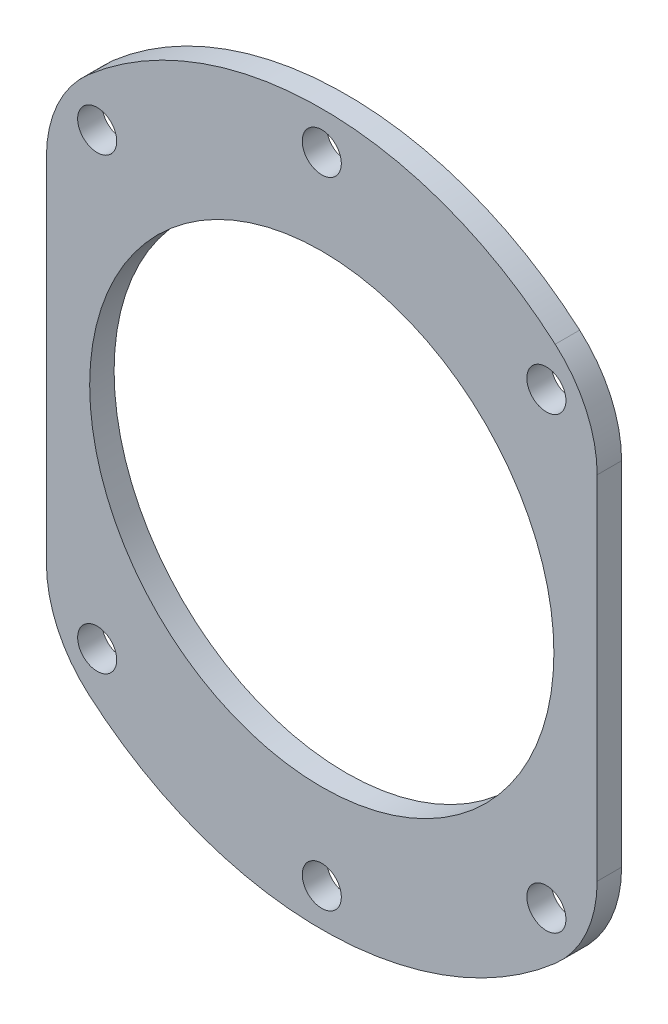
ISO-10303-21;
HEADER;
FILE_DESCRIPTION(('STEP AP214'),'2;1');
FILE_NAME('part.step','',(''),(''),'','','');
FILE_SCHEMA(('AUTOMOTIVE_DESIGN { 1 0 10303 214 1 1 1 1 }'));
ENDSEC;
DATA;
#1=APPLICATION_CONTEXT('core data for automotive mechanical design processes');
#2=APPLICATION_PROTOCOL_DEFINITION('international standard','automotive_design',2000,#1);
#3=PRODUCT_CONTEXT('',#1,'mechanical');
#4=PRODUCT('Part','Part','',(#3));
#5=PRODUCT_RELATED_PRODUCT_CATEGORY('part','',(#4));
#6=PRODUCT_DEFINITION_FORMATION('','',#4);
#7=PRODUCT_DEFINITION_CONTEXT('part definition',#1,'design');
#8=PRODUCT_DEFINITION('design','',#6,#7);
#9=PRODUCT_DEFINITION_SHAPE('','',#8);
#10=(LENGTH_UNIT() NAMED_UNIT(*) SI_UNIT(.MILLI.,.METRE.));
#11=(NAMED_UNIT(*) PLANE_ANGLE_UNIT() SI_UNIT($,.RADIAN.));
#12=(NAMED_UNIT(*) SI_UNIT($,.STERADIAN.) SOLID_ANGLE_UNIT());
#13=UNCERTAINTY_MEASURE_WITH_UNIT(LENGTH_MEASURE(1.E-05),#10,'distance_accuracy_value','');
#14=(GEOMETRIC_REPRESENTATION_CONTEXT(3) GLOBAL_UNCERTAINTY_ASSIGNED_CONTEXT((#13)) GLOBAL_UNIT_ASSIGNED_CONTEXT((#10,
#11,#12)) REPRESENTATION_CONTEXT('',''));
#15=CARTESIAN_POINT('',(0.,0.,0.));
#16=DIRECTION('',(0.,0.,1.));
#17=DIRECTION('',(1.,0.,0.));
#18=AXIS2_PLACEMENT_3D('',#15,#16,#17);
#19=CARTESIAN_POINT('',(-58.8,0.,2.));
#20=DIRECTION('',(0.,0.,1.));
#21=DIRECTION('',(1.,0.,0.));
#22=AXIS2_PLACEMENT_3D('',#19,#20,#21);
#23=PLANE('',#22);
#24=CARTESIAN_POINT('',(-58.8,26.,2.));
#25=DIRECTION('',(0.,0.,1.));
#26=DIRECTION('',(1.,0.,0.));
#27=AXIS2_PLACEMENT_3D('',#24,#25,#26);
#28=CIRCLE('',#27,1.6);
#29=CARTESIAN_POINT('',(-57.2,26.,2.));
#30=VERTEX_POINT('',#29);
#31=EDGE_CURVE('E255',#30,#30,#28,.T.);
#32=ORIENTED_EDGE('',*,*,#31,.F.);
#33=EDGE_LOOP('',(#32));
#34=FACE_BOUND('',#33,.T.);
#35=CARTESIAN_POINT('',(-77.1847763108502,18.3847763108502,2.));
#36=DIRECTION('',(0.,0.,1.));
#37=DIRECTION('',(1.,0.,0.));
#38=AXIS2_PLACEMENT_3D('',#35,#36,#37);
#39=CIRCLE('',#38,1.6);
#40=CARTESIAN_POINT('',(-75.5847763108502,18.3847763108502,2.));
#41=VERTEX_POINT('',#40);
#42=EDGE_CURVE('E229',#41,#41,#39,.T.);
#43=ORIENTED_EDGE('',*,*,#42,.F.);
#44=EDGE_LOOP('',(#43));
#45=FACE_BOUND('',#44,.T.);
#46=CARTESIAN_POINT('',(-77.1847763108502,-18.3847763108502,2.));
#47=DIRECTION('',(0.,0.,1.));
#48=DIRECTION('',(1.,0.,0.));
#49=AXIS2_PLACEMENT_3D('',#46,#47,#48);
#50=CIRCLE('',#49,1.6);
#51=CARTESIAN_POINT('',(-75.5847763108502,-18.3847763108502,2.));
#52=VERTEX_POINT('',#51);
#53=EDGE_CURVE('E228',#52,#52,#50,.T.);
#54=ORIENTED_EDGE('',*,*,#53,.F.);
#55=EDGE_LOOP('',(#54));
#56=FACE_BOUND('',#55,.T.);
#57=CARTESIAN_POINT('',(-58.8,-26.,2.));
#58=DIRECTION('',(0.,0.,1.));
#59=DIRECTION('',(1.,0.,0.));
#60=AXIS2_PLACEMENT_3D('',#57,#58,#59);
#61=CIRCLE('',#60,1.6);
#62=CARTESIAN_POINT('',(-57.2,-26.,2.));
#63=VERTEX_POINT('',#62);
#64=EDGE_CURVE('E237',#63,#63,#61,.T.);
#65=ORIENTED_EDGE('',*,*,#64,.F.);
#66=EDGE_LOOP('',(#65));
#67=FACE_BOUND('',#66,.T.);
#68=CARTESIAN_POINT('',(-40.4152236891498,-18.3847763108502,2.));
#69=DIRECTION('',(0.,0.,1.));
#70=DIRECTION('',(1.,0.,0.));
#71=AXIS2_PLACEMENT_3D('',#68,#69,#70);
#72=CIRCLE('',#71,1.6);
#73=CARTESIAN_POINT('',(-38.8152236891498,-18.3847763108502,2.));
#74=VERTEX_POINT('',#73);
#75=EDGE_CURVE('E244',#74,#74,#72,.T.);
#76=ORIENTED_EDGE('',*,*,#75,.F.);
#77=EDGE_LOOP('',(#76));
#78=FACE_BOUND('',#77,.T.);
#79=CARTESIAN_POINT('',(-40.4152236891497,18.3847763108502,2.));
#80=DIRECTION('',(0.,0.,1.));
#81=DIRECTION('',(1.,0.,0.));
#82=AXIS2_PLACEMENT_3D('',#79,#80,#81);
#83=CIRCLE('',#82,1.59999999999999);
#84=CARTESIAN_POINT('',(-38.8152236891498,18.3847763108502,2.));
#85=VERTEX_POINT('',#84);
#86=EDGE_CURVE('E252',#85,#85,#83,.T.);
#87=ORIENTED_EDGE('',*,*,#86,.F.);
#88=EDGE_LOOP('',(#87));
#89=FACE_BOUND('',#88,.T.);
#90=DIRECTION('',(0.,-1.,0.));
#91=VECTOR('',#90,1.);
#92=CARTESIAN_POINT('',(-81.3413600290393,18.4037248414888,2.));
#93=LINE('',#92,#91);
#94=CARTESIAN_POINT('',(-81.3413600290393,14.4057033365961,2.));
#95=VERTEX_POINT('',#94);
#96=CARTESIAN_POINT('',(-81.3413600290393,-14.4057033365961,2.));
#97=VERTEX_POINT('',#96);
#98=EDGE_CURVE('E154',#95,#97,#93,.T.);
#99=ORIENTED_EDGE('',*,*,#98,.T.);
#100=CARTESIAN_POINT('',(-71.3413600290393,-14.4057033365961,2.));
#101=DIRECTION('',(0.,0.,1.));
#102=DIRECTION('',(1.,0.,0.));
#103=AXIS2_PLACEMENT_3D('',#100,#101,#102);
#104=CIRCLE('',#103,10.);
#105=CARTESIAN_POINT('',(-77.9075171123059,-21.9479563924056,2.));
#106=VERTEX_POINT('',#105);
#107=EDGE_CURVE('E183',#97,#106,#104,.T.);
#108=ORIENTED_EDGE('',*,*,#107,.T.);
#109=CARTESIAN_POINT('',(-58.8,0.,2.));
#110=DIRECTION('',(0.,0.,1.));
#111=DIRECTION('',(1.,0.,0.));
#112=AXIS2_PLACEMENT_3D('',#109,#110,#111);
#113=CIRCLE('',#112,29.1);
#114=CARTESIAN_POINT('',(-39.6924828876942,-21.9479563924057,2.));
#115=VERTEX_POINT('',#114);
#116=EDGE_CURVE('E130',#106,#115,#113,.T.);
#117=ORIENTED_EDGE('',*,*,#116,.T.);
#118=CARTESIAN_POINT('',(-46.2586399709608,-14.4057033365962,2.));
#119=DIRECTION('',(0.,0.,1.));
#120=DIRECTION('',(1.,0.,0.));
#121=AXIS2_PLACEMENT_3D('',#118,#119,#120);
#122=CIRCLE('',#121,10.);
#123=CARTESIAN_POINT('',(-36.2586399709608,-14.4057033365962,2.));
#124=VERTEX_POINT('',#123);
#125=EDGE_CURVE('E177',#115,#124,#122,.T.);
#126=ORIENTED_EDGE('',*,*,#125,.T.);
#127=DIRECTION('',(0.,1.,0.));
#128=VECTOR('',#127,1.);
#129=CARTESIAN_POINT('',(-36.2586399709608,18.4037248414888,2.));
#130=LINE('',#129,#128);
#131=CARTESIAN_POINT('',(-36.2586399709608,14.4057033365962,2.));
#132=VERTEX_POINT('',#131);
#133=EDGE_CURVE('E196',#124,#132,#130,.T.);
#134=ORIENTED_EDGE('',*,*,#133,.T.);
#135=CARTESIAN_POINT('',(-46.2586399709608,14.4057033365962,2.));
#136=DIRECTION('',(0.,0.,1.));
#137=DIRECTION('',(1.,0.,0.));
#138=AXIS2_PLACEMENT_3D('',#135,#136,#137);
#139=CIRCLE('',#138,10.);
#140=CARTESIAN_POINT('',(-39.6924828876942,21.9479563924057,2.));
#141=VERTEX_POINT('',#140);
#142=EDGE_CURVE('E64',#132,#141,#139,.T.);
#143=ORIENTED_EDGE('',*,*,#142,.T.);
#144=CARTESIAN_POINT('',(-58.8,0.,2.));
#145=DIRECTION('',(0.,0.,1.));
#146=DIRECTION('',(1.,0.,0.));
#147=AXIS2_PLACEMENT_3D('',#144,#145,#146);
#148=CIRCLE('',#147,29.1);
#149=CARTESIAN_POINT('',(-77.9075171123059,21.9479563924056,2.));
#150=VERTEX_POINT('',#149);
#151=EDGE_CURVE('E203',#141,#150,#148,.T.);
#152=ORIENTED_EDGE('',*,*,#151,.T.);
#153=CARTESIAN_POINT('',(-71.3413600290393,14.4057033365961,2.));
#154=DIRECTION('',(0.,0.,1.));
#155=DIRECTION('',(1.,0.,0.));
#156=AXIS2_PLACEMENT_3D('',#153,#154,#155);
#157=CIRCLE('',#156,10.);
#158=EDGE_CURVE('E180',#150,#95,#157,.T.);
#159=ORIENTED_EDGE('',*,*,#158,.T.);
#160=EDGE_LOOP('',(#99,#108,#117,#126,#134,#143,#152,#159));
#161=FACE_BOUND('',#160,.T.);
#162=CARTESIAN_POINT('',(-58.8,0.,2.));
#163=DIRECTION('',(0.,0.,1.));
#164=DIRECTION('',(1.,0.,0.));
#165=AXIS2_PLACEMENT_3D('',#162,#163,#164);
#166=CIRCLE('',#165,19.);
#167=CARTESIAN_POINT('',(-39.8,0.,2.));
#168=VERTEX_POINT('',#167);
#169=EDGE_CURVE('E141',#168,#168,#166,.T.);
#170=ORIENTED_EDGE('',*,*,#169,.F.);
#171=EDGE_LOOP('',(#170));
#172=FACE_BOUND('',#171,.T.);
#173=ADVANCED_FACE('F41',(#34,#45,#56,#67,#78,#89,#161,#172),#23,.T.);
#174=CARTESIAN_POINT('',(-58.8,0.,0.));
#175=DIRECTION('',(0.,0.,1.));
#176=DIRECTION('',(1.,0.,0.));
#177=AXIS2_PLACEMENT_3D('',#174,#175,#176);
#178=PLANE('',#177);
#179=CARTESIAN_POINT('',(-58.8,26.,0.));
#180=DIRECTION('',(0.,0.,1.));
#181=DIRECTION('',(1.,0.,0.));
#182=AXIS2_PLACEMENT_3D('',#179,#180,#181);
#183=CIRCLE('',#182,1.6);
#184=CARTESIAN_POINT('',(-57.2,26.,0.));
#185=VERTEX_POINT('',#184);
#186=EDGE_CURVE('E222',#185,#185,#183,.T.);
#187=ORIENTED_EDGE('',*,*,#186,.T.);
#188=EDGE_LOOP('',(#187));
#189=FACE_BOUND('',#188,.T.);
#190=CARTESIAN_POINT('',(-77.1847763108502,18.3847763108502,0.));
#191=DIRECTION('',(0.,0.,1.));
#192=DIRECTION('',(1.,0.,0.));
#193=AXIS2_PLACEMENT_3D('',#190,#191,#192);
#194=CIRCLE('',#193,1.6);
#195=CARTESIAN_POINT('',(-75.5847763108502,18.3847763108502,0.));
#196=VERTEX_POINT('',#195);
#197=EDGE_CURVE('E256',#196,#196,#194,.T.);
#198=ORIENTED_EDGE('',*,*,#197,.T.);
#199=EDGE_LOOP('',(#198));
#200=FACE_BOUND('',#199,.T.);
#201=CARTESIAN_POINT('',(-77.1847763108502,-18.3847763108502,0.));
#202=DIRECTION('',(0.,0.,1.));
#203=DIRECTION('',(1.,0.,0.));
#204=AXIS2_PLACEMENT_3D('',#201,#202,#203);
#205=CIRCLE('',#204,1.6);
#206=CARTESIAN_POINT('',(-75.5847763108502,-18.3847763108502,0.));
#207=VERTEX_POINT('',#206);
#208=EDGE_CURVE('E224',#207,#207,#205,.T.);
#209=ORIENTED_EDGE('',*,*,#208,.T.);
#210=EDGE_LOOP('',(#209));
#211=FACE_BOUND('',#210,.T.);
#212=CARTESIAN_POINT('',(-58.8,-26.,0.));
#213=DIRECTION('',(0.,0.,1.));
#214=DIRECTION('',(1.,0.,0.));
#215=AXIS2_PLACEMENT_3D('',#212,#213,#214);
#216=CIRCLE('',#215,1.6);
#217=CARTESIAN_POINT('',(-57.2,-26.,0.));
#218=VERTEX_POINT('',#217);
#219=EDGE_CURVE('E233',#218,#218,#216,.T.);
#220=ORIENTED_EDGE('',*,*,#219,.T.);
#221=EDGE_LOOP('',(#220));
#222=FACE_BOUND('',#221,.T.);
#223=CARTESIAN_POINT('',(-40.4152236891498,-18.3847763108502,0.));
#224=DIRECTION('',(0.,0.,1.));
#225=DIRECTION('',(1.,0.,0.));
#226=AXIS2_PLACEMENT_3D('',#223,#224,#225);
#227=CIRCLE('',#226,1.6);
#228=CARTESIAN_POINT('',(-38.8152236891498,-18.3847763108502,0.));
#229=VERTEX_POINT('',#228);
#230=EDGE_CURVE('E241',#229,#229,#227,.T.);
#231=ORIENTED_EDGE('',*,*,#230,.T.);
#232=EDGE_LOOP('',(#231));
#233=FACE_BOUND('',#232,.T.);
#234=CARTESIAN_POINT('',(-40.4152236891497,18.3847763108502,0.));
#235=DIRECTION('',(0.,0.,1.));
#236=DIRECTION('',(1.,0.,0.));
#237=AXIS2_PLACEMENT_3D('',#234,#235,#236);
#238=CIRCLE('',#237,1.59999999999999);
#239=CARTESIAN_POINT('',(-38.8152236891498,18.3847763108502,0.));
#240=VERTEX_POINT('',#239);
#241=EDGE_CURVE('E248',#240,#240,#238,.T.);
#242=ORIENTED_EDGE('',*,*,#241,.T.);
#243=EDGE_LOOP('',(#242));
#244=FACE_BOUND('',#243,.T.);
#245=CARTESIAN_POINT('',(-58.8,0.,0.));
#246=DIRECTION('',(0.,0.,1.));
#247=DIRECTION('',(1.,0.,0.));
#248=AXIS2_PLACEMENT_3D('',#245,#246,#247);
#249=CIRCLE('',#248,29.1);
#250=CARTESIAN_POINT('',(-77.9075171123059,-21.9479563924056,0.));
#251=VERTEX_POINT('',#250);
#252=CARTESIAN_POINT('',(-39.6924828876942,-21.9479563924057,0.));
#253=VERTEX_POINT('',#252);
#254=EDGE_CURVE('E127',#251,#253,#249,.T.);
#255=ORIENTED_EDGE('',*,*,#254,.F.);
#256=CARTESIAN_POINT('',(-71.3413600290393,-14.4057033365961,0.));
#257=DIRECTION('',(0.,0.,1.));
#258=DIRECTION('',(1.,0.,0.));
#259=AXIS2_PLACEMENT_3D('',#256,#257,#258);
#260=CIRCLE('',#259,10.);
#261=CARTESIAN_POINT('',(-81.3413600290393,-14.4057033365961,0.));
#262=VERTEX_POINT('',#261);
#263=EDGE_CURVE('E109',#251,#262,#260,.F.);
#264=ORIENTED_EDGE('',*,*,#263,.T.);
#265=DIRECTION('',(0.,-1.,0.));
#266=VECTOR('',#265,1.);
#267=CARTESIAN_POINT('',(-81.3413600290393,18.4037248414888,0.));
#268=LINE('',#267,#266);
#269=CARTESIAN_POINT('',(-81.3413600290393,14.4057033365961,0.));
#270=VERTEX_POINT('',#269);
#271=EDGE_CURVE('E159',#270,#262,#268,.T.);
#272=ORIENTED_EDGE('',*,*,#271,.F.);
#273=CARTESIAN_POINT('',(-71.3413600290393,14.4057033365961,0.));
#274=DIRECTION('',(0.,0.,1.));
#275=DIRECTION('',(1.,0.,0.));
#276=AXIS2_PLACEMENT_3D('',#273,#274,#275);
#277=CIRCLE('',#276,10.);
#278=CARTESIAN_POINT('',(-77.9075171123059,21.9479563924056,0.));
#279=VERTEX_POINT('',#278);
#280=EDGE_CURVE('E121',#270,#279,#277,.F.);
#281=ORIENTED_EDGE('',*,*,#280,.T.);
#282=CARTESIAN_POINT('',(-58.8,0.,0.));
#283=DIRECTION('',(0.,0.,1.));
#284=DIRECTION('',(1.,0.,0.));
#285=AXIS2_PLACEMENT_3D('',#282,#283,#284);
#286=CIRCLE('',#285,29.1);
#287=CARTESIAN_POINT('',(-39.6924828876942,21.9479563924057,0.));
#288=VERTEX_POINT('',#287);
#289=EDGE_CURVE('E147',#288,#279,#286,.T.);
#290=ORIENTED_EDGE('',*,*,#289,.F.);
#291=CARTESIAN_POINT('',(-46.2586399709608,14.4057033365962,0.));
#292=DIRECTION('',(0.,0.,1.));
#293=DIRECTION('',(1.,0.,0.));
#294=AXIS2_PLACEMENT_3D('',#291,#292,#293);
#295=CIRCLE('',#294,10.);
#296=CARTESIAN_POINT('',(-36.2586399709608,14.4057033365962,0.));
#297=VERTEX_POINT('',#296);
#298=EDGE_CURVE('E132',#288,#297,#295,.F.);
#299=ORIENTED_EDGE('',*,*,#298,.T.);
#300=DIRECTION('',(0.,1.,0.));
#301=VECTOR('',#300,1.);
#302=CARTESIAN_POINT('',(-36.2586399709608,18.4037248414888,0.));
#303=LINE('',#302,#301);
#304=CARTESIAN_POINT('',(-36.2586399709608,-14.4057033365962,0.));
#305=VERTEX_POINT('',#304);
#306=EDGE_CURVE('E140',#305,#297,#303,.T.);
#307=ORIENTED_EDGE('',*,*,#306,.F.);
#308=CARTESIAN_POINT('',(-46.2586399709608,-14.4057033365962,0.));
#309=DIRECTION('',(0.,0.,1.));
#310=DIRECTION('',(1.,0.,0.));
#311=AXIS2_PLACEMENT_3D('',#308,#309,#310);
#312=CIRCLE('',#311,10.);
#313=EDGE_CURVE('E138',#305,#253,#312,.F.);
#314=ORIENTED_EDGE('',*,*,#313,.T.);
#315=EDGE_LOOP('',(#255,#264,#272,#281,#290,#299,#307,#314));
#316=FACE_BOUND('',#315,.T.);
#317=CARTESIAN_POINT('',(-58.8,0.,0.));
#318=DIRECTION('',(0.,0.,1.));
#319=DIRECTION('',(1.,0.,0.));
#320=AXIS2_PLACEMENT_3D('',#317,#318,#319);
#321=CIRCLE('',#320,19.);
#322=CARTESIAN_POINT('',(-39.8,0.,0.));
#323=VERTEX_POINT('',#322);
#324=EDGE_CURVE('E151',#323,#323,#321,.T.);
#325=ORIENTED_EDGE('',*,*,#324,.T.);
#326=EDGE_LOOP('',(#325));
#327=FACE_BOUND('',#326,.T.);
#328=ADVANCED_FACE('F135',(#189,#200,#211,#222,#233,#244,#316,#327),#178,.F.);
#329=CARTESIAN_POINT('',(-58.8,0.,2.));
#330=DIRECTION('',(0.,0.,-1.));
#331=DIRECTION('',(-1.,0.,0.));
#332=AXIS2_PLACEMENT_3D('',#329,#330,#331);
#333=CYLINDRICAL_SURFACE('',#332,29.1);
#334=ORIENTED_EDGE('',*,*,#116,.F.);
#335=DIRECTION('',(0.,0.,-1.));
#336=VECTOR('',#335,1.);
#337=CARTESIAN_POINT('',(-77.9075171123059,-21.9479563924056,2.));
#338=LINE('',#337,#336);
#339=EDGE_CURVE('E113',#106,#251,#338,.T.);
#340=ORIENTED_EDGE('',*,*,#339,.T.);
#341=ORIENTED_EDGE('',*,*,#254,.T.);
#342=DIRECTION('',(0.,0.,-1.));
#343=VECTOR('',#342,1.);
#344=CARTESIAN_POINT('',(-39.6924828876942,-21.9479563924057,2.));
#345=LINE('',#344,#343);
#346=EDGE_CURVE('E133',#253,#115,#345,.F.);
#347=ORIENTED_EDGE('',*,*,#346,.T.);
#348=EDGE_LOOP('',(#334,#340,#341,#347));
#349=FACE_BOUND('',#348,.T.);
#350=ADVANCED_FACE('F126',(#349),#333,.T.);
#351=CARTESIAN_POINT('',(-36.2586399709608,18.4037248414888,2.));
#352=DIRECTION('',(-1.,0.,0.));
#353=DIRECTION('',(0.,0.,1.));
#354=AXIS2_PLACEMENT_3D('',#351,#352,#353);
#355=PLANE('',#354);
#356=ORIENTED_EDGE('',*,*,#133,.F.);
#357=DIRECTION('',(0.,0.,-1.));
#358=VECTOR('',#357,1.);
#359=CARTESIAN_POINT('',(-36.2586399709608,-14.4057033365962,2.));
#360=LINE('',#359,#358);
#361=EDGE_CURVE('E11',#124,#305,#360,.T.);
#362=ORIENTED_EDGE('',*,*,#361,.T.);
#363=ORIENTED_EDGE('',*,*,#306,.T.);
#364=DIRECTION('',(0.,0.,-1.));
#365=VECTOR('',#364,1.);
#366=CARTESIAN_POINT('',(-36.2586399709608,14.4057033365962,2.));
#367=LINE('',#366,#365);
#368=EDGE_CURVE('E50',#297,#132,#367,.F.);
#369=ORIENTED_EDGE('',*,*,#368,.T.);
#370=EDGE_LOOP('',(#356,#362,#363,#369));
#371=FACE_BOUND('',#370,.T.);
#372=ADVANCED_FACE('F195',(#371),#355,.F.);
#373=CARTESIAN_POINT('',(-58.8,0.,2.));
#374=DIRECTION('',(0.,0.,-1.));
#375=DIRECTION('',(-1.,0.,0.));
#376=AXIS2_PLACEMENT_3D('',#373,#374,#375);
#377=CYLINDRICAL_SURFACE('',#376,29.1);
#378=ORIENTED_EDGE('',*,*,#289,.T.);
#379=DIRECTION('',(0.,0.,-1.));
#380=VECTOR('',#379,1.);
#381=CARTESIAN_POINT('',(-77.9075171123059,21.9479563924056,2.));
#382=LINE('',#381,#380);
#383=EDGE_CURVE('E57',#279,#150,#382,.F.);
#384=ORIENTED_EDGE('',*,*,#383,.T.);
#385=ORIENTED_EDGE('',*,*,#151,.F.);
#386=DIRECTION('',(0.,0.,-1.));
#387=VECTOR('',#386,1.);
#388=CARTESIAN_POINT('',(-39.6924828876942,21.9479563924057,2.));
#389=LINE('',#388,#387);
#390=EDGE_CURVE('E186',#141,#288,#389,.T.);
#391=ORIENTED_EDGE('',*,*,#390,.T.);
#392=EDGE_LOOP('',(#378,#384,#385,#391));
#393=FACE_BOUND('',#392,.T.);
#394=ADVANCED_FACE('F207',(#393),#377,.T.);
#395=CARTESIAN_POINT('',(-81.3413600290393,18.4037248414888,2.));
#396=DIRECTION('',(1.,0.,0.));
#397=DIRECTION('',(0.,0.,-1.));
#398=AXIS2_PLACEMENT_3D('',#395,#396,#397);
#399=PLANE('',#398);
#400=ORIENTED_EDGE('',*,*,#271,.T.);
#401=DIRECTION('',(0.,0.,-1.));
#402=VECTOR('',#401,1.);
#403=CARTESIAN_POINT('',(-81.3413600290393,-14.4057033365961,2.));
#404=LINE('',#403,#402);
#405=EDGE_CURVE('E114',#262,#97,#404,.F.);
#406=ORIENTED_EDGE('',*,*,#405,.T.);
#407=ORIENTED_EDGE('',*,*,#98,.F.);
#408=DIRECTION('',(0.,0.,-1.));
#409=VECTOR('',#408,1.);
#410=CARTESIAN_POINT('',(-81.3413600290393,14.4057033365961,2.));
#411=LINE('',#410,#409);
#412=EDGE_CURVE('E120',#95,#270,#411,.T.);
#413=ORIENTED_EDGE('',*,*,#412,.T.);
#414=EDGE_LOOP('',(#400,#406,#407,#413));
#415=FACE_BOUND('',#414,.T.);
#416=ADVANCED_FACE('F214',(#415),#399,.F.);
#417=CARTESIAN_POINT('',(-58.8,0.,2.));
#418=DIRECTION('',(0.,0.,-1.));
#419=DIRECTION('',(-1.,0.,0.));
#420=AXIS2_PLACEMENT_3D('',#417,#418,#419);
#421=CYLINDRICAL_SURFACE('',#420,19.);
#422=ORIENTED_EDGE('',*,*,#169,.T.);
#423=EDGE_LOOP('',(#422));
#424=FACE_BOUND('',#423,.T.);
#425=ORIENTED_EDGE('',*,*,#324,.F.);
#426=EDGE_LOOP('',(#425));
#427=FACE_BOUND('',#426,.T.);
#428=ADVANCED_FACE('F295',(#424,#427),#421,.F.);
#429=CARTESIAN_POINT('',(-40.4152236891497,18.3847763108502,0.));
#430=DIRECTION('',(0.,0.,1.));
#431=DIRECTION('',(1.,0.,0.));
#432=AXIS2_PLACEMENT_3D('',#429,#430,#431);
#433=CYLINDRICAL_SURFACE('',#432,1.59999999999999);
#434=ORIENTED_EDGE('',*,*,#241,.F.);
#435=EDGE_LOOP('',(#434));
#436=FACE_BOUND('',#435,.T.);
#437=ORIENTED_EDGE('',*,*,#86,.T.);
#438=EDGE_LOOP('',(#437));
#439=FACE_BOUND('',#438,.T.);
#440=ADVANCED_FACE('F292',(#436,#439),#433,.F.);
#441=CARTESIAN_POINT('',(-40.4152236891498,-18.3847763108502,0.));
#442=DIRECTION('',(0.,0.,1.));
#443=DIRECTION('',(1.,0.,0.));
#444=AXIS2_PLACEMENT_3D('',#441,#442,#443);
#445=CYLINDRICAL_SURFACE('',#444,1.6);
#446=ORIENTED_EDGE('',*,*,#230,.F.);
#447=EDGE_LOOP('',(#446));
#448=FACE_BOUND('',#447,.T.);
#449=ORIENTED_EDGE('',*,*,#75,.T.);
#450=EDGE_LOOP('',(#449));
#451=FACE_BOUND('',#450,.T.);
#452=ADVANCED_FACE('F294',(#448,#451),#445,.F.);
#453=CARTESIAN_POINT('',(-58.8,-26.,0.));
#454=DIRECTION('',(0.,0.,1.));
#455=DIRECTION('',(1.,0.,0.));
#456=AXIS2_PLACEMENT_3D('',#453,#454,#455);
#457=CYLINDRICAL_SURFACE('',#456,1.6);
#458=ORIENTED_EDGE('',*,*,#219,.F.);
#459=EDGE_LOOP('',(#458));
#460=FACE_BOUND('',#459,.T.);
#461=ORIENTED_EDGE('',*,*,#64,.T.);
#462=EDGE_LOOP('',(#461));
#463=FACE_BOUND('',#462,.T.);
#464=ADVANCED_FACE('F302',(#460,#463),#457,.F.);
#465=CARTESIAN_POINT('',(-77.1847763108502,-18.3847763108502,0.));
#466=DIRECTION('',(0.,0.,1.));
#467=DIRECTION('',(1.,0.,0.));
#468=AXIS2_PLACEMENT_3D('',#465,#466,#467);
#469=CYLINDRICAL_SURFACE('',#468,1.6);
#470=ORIENTED_EDGE('',*,*,#208,.F.);
#471=EDGE_LOOP('',(#470));
#472=FACE_BOUND('',#471,.T.);
#473=ORIENTED_EDGE('',*,*,#53,.T.);
#474=EDGE_LOOP('',(#473));
#475=FACE_BOUND('',#474,.T.);
#476=ADVANCED_FACE('F312',(#472,#475),#469,.F.);
#477=CARTESIAN_POINT('',(-77.1847763108502,18.3847763108502,0.));
#478=DIRECTION('',(0.,0.,1.));
#479=DIRECTION('',(1.,0.,0.));
#480=AXIS2_PLACEMENT_3D('',#477,#478,#479);
#481=CYLINDRICAL_SURFACE('',#480,1.6);
#482=ORIENTED_EDGE('',*,*,#197,.F.);
#483=EDGE_LOOP('',(#482));
#484=FACE_BOUND('',#483,.T.);
#485=ORIENTED_EDGE('',*,*,#42,.T.);
#486=EDGE_LOOP('',(#485));
#487=FACE_BOUND('',#486,.T.);
#488=ADVANCED_FACE('F275',(#484,#487),#481,.F.);
#489=CARTESIAN_POINT('',(-58.8,26.,0.));
#490=DIRECTION('',(0.,0.,1.));
#491=DIRECTION('',(1.,0.,0.));
#492=AXIS2_PLACEMENT_3D('',#489,#490,#491);
#493=CYLINDRICAL_SURFACE('',#492,1.6);
#494=ORIENTED_EDGE('',*,*,#186,.F.);
#495=EDGE_LOOP('',(#494));
#496=FACE_BOUND('',#495,.T.);
#497=ORIENTED_EDGE('',*,*,#31,.T.);
#498=EDGE_LOOP('',(#497));
#499=FACE_BOUND('',#498,.T.);
#500=ADVANCED_FACE('F272',(#496,#499),#493,.F.);
#501=CARTESIAN_POINT('',(-71.3413600290393,-14.4057033365961,2.));
#502=DIRECTION('',(0.,0.,-1.));
#503=DIRECTION('',(-1.,0.,0.));
#504=AXIS2_PLACEMENT_3D('',#501,#502,#503);
#505=CYLINDRICAL_SURFACE('',#504,10.);
#506=ORIENTED_EDGE('',*,*,#107,.F.);
#507=ORIENTED_EDGE('',*,*,#405,.F.);
#508=ORIENTED_EDGE('',*,*,#263,.F.);
#509=ORIENTED_EDGE('',*,*,#339,.F.);
#510=EDGE_LOOP('',(#506,#507,#508,#509));
#511=FACE_BOUND('',#510,.T.);
#512=ADVANCED_FACE('F112',(#511),#505,.T.);
#513=CARTESIAN_POINT('',(-71.3413600290393,14.4057033365961,2.));
#514=DIRECTION('',(0.,0.,-1.));
#515=DIRECTION('',(-1.,0.,0.));
#516=AXIS2_PLACEMENT_3D('',#513,#514,#515);
#517=CYLINDRICAL_SURFACE('',#516,10.);
#518=ORIENTED_EDGE('',*,*,#158,.F.);
#519=ORIENTED_EDGE('',*,*,#383,.F.);
#520=ORIENTED_EDGE('',*,*,#280,.F.);
#521=ORIENTED_EDGE('',*,*,#412,.F.);
#522=EDGE_LOOP('',(#518,#519,#520,#521));
#523=FACE_BOUND('',#522,.T.);
#524=ADVANCED_FACE('F211',(#523),#517,.T.);
#525=CARTESIAN_POINT('',(-46.2586399709608,-14.4057033365962,2.));
#526=DIRECTION('',(0.,0.,-1.));
#527=DIRECTION('',(-1.,0.,0.));
#528=AXIS2_PLACEMENT_3D('',#525,#526,#527);
#529=CYLINDRICAL_SURFACE('',#528,10.);
#530=ORIENTED_EDGE('',*,*,#125,.F.);
#531=ORIENTED_EDGE('',*,*,#346,.F.);
#532=ORIENTED_EDGE('',*,*,#313,.F.);
#533=ORIENTED_EDGE('',*,*,#361,.F.);
#534=EDGE_LOOP('',(#530,#531,#532,#533));
#535=FACE_BOUND('',#534,.T.);
#536=ADVANCED_FACE('F330',(#535),#529,.T.);
#537=CARTESIAN_POINT('',(-46.2586399709608,14.4057033365962,2.));
#538=DIRECTION('',(0.,0.,-1.));
#539=DIRECTION('',(-1.,0.,0.));
#540=AXIS2_PLACEMENT_3D('',#537,#538,#539);
#541=CYLINDRICAL_SURFACE('',#540,10.);
#542=ORIENTED_EDGE('',*,*,#142,.F.);
#543=ORIENTED_EDGE('',*,*,#368,.F.);
#544=ORIENTED_EDGE('',*,*,#298,.F.);
#545=ORIENTED_EDGE('',*,*,#390,.F.);
#546=EDGE_LOOP('',(#542,#543,#544,#545));
#547=FACE_BOUND('',#546,.T.);
#548=ADVANCED_FACE('F43',(#547),#541,.T.);
#549=CLOSED_SHELL('',(#173,#328,#350,#372,#394,#416,#428,#440,#452,#464,#476,#488,#500,#512,
#524,#536,#548));
#550=MANIFOLD_SOLID_BREP('B2',#549);
#551=ADVANCED_BREP_SHAPE_REPRESENTATION('',(#18,#550),#14);
#552=SHAPE_DEFINITION_REPRESENTATION(#9,#551);
ENDSEC;
END-ISO-10303-21;
